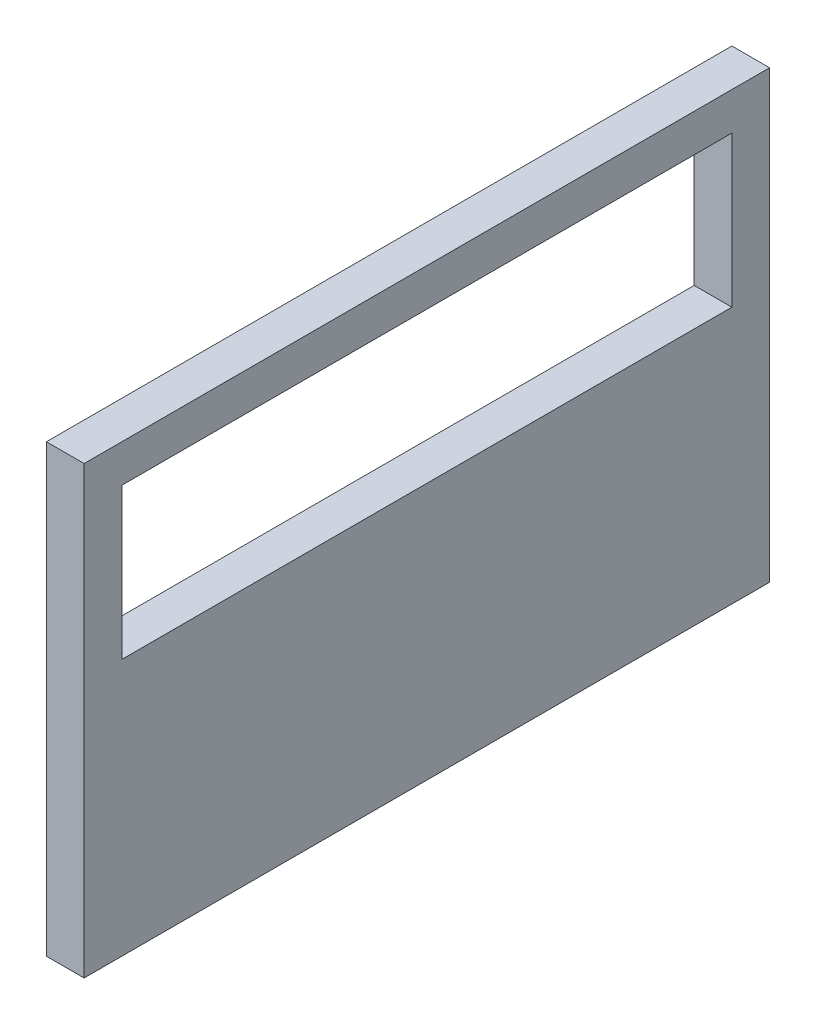
ISO-10303-21;
HEADER;
FILE_DESCRIPTION(('STEP AP214'),'2;1');
FILE_NAME('part.step','',(''),(''),'','','');
FILE_SCHEMA(('AUTOMOTIVE_DESIGN { 1 0 10303 214 1 1 1 1 }'));
ENDSEC;
DATA;
#1=APPLICATION_CONTEXT('core data for automotive mechanical design processes');
#2=APPLICATION_PROTOCOL_DEFINITION('international standard','automotive_design',2000,#1);
#3=PRODUCT_CONTEXT('',#1,'mechanical');
#4=PRODUCT('Part','Part','',(#3));
#5=PRODUCT_RELATED_PRODUCT_CATEGORY('part','',(#4));
#6=PRODUCT_DEFINITION_FORMATION('','',#4);
#7=PRODUCT_DEFINITION_CONTEXT('part definition',#1,'design');
#8=PRODUCT_DEFINITION('design','',#6,#7);
#9=PRODUCT_DEFINITION_SHAPE('','',#8);
#10=(LENGTH_UNIT() NAMED_UNIT(*) SI_UNIT(.MILLI.,.METRE.));
#11=(NAMED_UNIT(*) PLANE_ANGLE_UNIT() SI_UNIT($,.RADIAN.));
#12=(NAMED_UNIT(*) SI_UNIT($,.STERADIAN.) SOLID_ANGLE_UNIT());
#13=UNCERTAINTY_MEASURE_WITH_UNIT(LENGTH_MEASURE(1.E-05),#10,'distance_accuracy_value','');
#14=(GEOMETRIC_REPRESENTATION_CONTEXT(3) GLOBAL_UNCERTAINTY_ASSIGNED_CONTEXT((#13)) GLOBAL_UNIT_ASSIGNED_CONTEXT((#10,
#11,#12)) REPRESENTATION_CONTEXT('',''));
#15=CARTESIAN_POINT('',(0.,0.,0.));
#16=DIRECTION('',(0.,0.,1.));
#17=DIRECTION('',(1.,0.,0.));
#18=AXIS2_PLACEMENT_3D('',#15,#16,#17);
#19=CARTESIAN_POINT('',(0.00999999999999891,0.,400.01));
#20=DIRECTION('',(0.,-1.,0.));
#21=DIRECTION('',(-1.,0.,0.));
#22=AXIS2_PLACEMENT_3D('',#19,#20,#21);
#23=PLANE('',#22);
#24=DIRECTION('',(0.,0.,1.));
#25=VECTOR('',#24,1.);
#26=CARTESIAN_POINT('',(-22.,0.,200.));
#27=LINE('',#26,#25);
#28=CARTESIAN_POINT('',(-22.,0.,0.));
#29=VERTEX_POINT('',#28);
#30=CARTESIAN_POINT('',(-22.,0.,400.));
#31=VERTEX_POINT('',#30);
#32=EDGE_CURVE('E80',#29,#31,#27,.T.);
#33=ORIENTED_EDGE('',*,*,#32,.F.);
#34=DIRECTION('',(-1.,0.,0.));
#35=VECTOR('',#34,1.);
#36=CARTESIAN_POINT('',(-11.,0.,0.));
#37=LINE('',#36,#35);
#38=CARTESIAN_POINT('',(0.,0.,0.));
#39=VERTEX_POINT('',#38);
#40=EDGE_CURVE('E21',#39,#29,#37,.T.);
#41=ORIENTED_EDGE('',*,*,#40,.F.);
#42=DIRECTION('',(0.,0.,-1.));
#43=VECTOR('',#42,1.);
#44=CARTESIAN_POINT('',(0.,0.,200.));
#45=LINE('',#44,#43);
#46=CARTESIAN_POINT('',(0.,0.,400.));
#47=VERTEX_POINT('',#46);
#48=EDGE_CURVE('E86',#47,#39,#45,.T.);
#49=ORIENTED_EDGE('',*,*,#48,.F.);
#50=DIRECTION('',(1.,0.,0.));
#51=VECTOR('',#50,1.);
#52=CARTESIAN_POINT('',(-11.,0.,400.));
#53=LINE('',#52,#51);
#54=EDGE_CURVE('E83',#31,#47,#53,.T.);
#55=ORIENTED_EDGE('',*,*,#54,.F.);
#56=EDGE_LOOP('',(#33,#41,#49,#55));
#57=FACE_BOUND('',#56,.T.);
#58=ADVANCED_FACE('F17',(#57),#23,.T.);
#59=CARTESIAN_POINT('',(0.01,-0.01,0.));
#60=DIRECTION('',(0.,0.,-1.));
#61=DIRECTION('',(-1.,0.,0.));
#62=AXIS2_PLACEMENT_3D('',#59,#60,#61);
#63=PLANE('',#62);
#64=DIRECTION('',(-1.,0.,0.));
#65=VECTOR('',#64,1.);
#66=CARTESIAN_POINT('',(-11.,260.,0.));
#67=LINE('',#66,#65);
#68=CARTESIAN_POINT('',(0.,260.,0.));
#69=VERTEX_POINT('',#68);
#70=CARTESIAN_POINT('',(-22.,260.,0.));
#71=VERTEX_POINT('',#70);
#72=EDGE_CURVE('E91',#69,#71,#67,.T.);
#73=ORIENTED_EDGE('',*,*,#72,.F.);
#74=DIRECTION('',(0.,1.,0.));
#75=VECTOR('',#74,1.);
#76=CARTESIAN_POINT('',(0.,130.,0.));
#77=LINE('',#76,#75);
#78=EDGE_CURVE('E114',#39,#69,#77,.T.);
#79=ORIENTED_EDGE('',*,*,#78,.F.);
#80=ORIENTED_EDGE('',*,*,#40,.T.);
#81=DIRECTION('',(0.,-1.,0.));
#82=VECTOR('',#81,1.);
#83=CARTESIAN_POINT('',(-22.,130.,0.));
#84=LINE('',#83,#82);
#85=EDGE_CURVE('E104',#71,#29,#84,.T.);
#86=ORIENTED_EDGE('',*,*,#85,.F.);
#87=EDGE_LOOP('',(#73,#79,#80,#86));
#88=FACE_BOUND('',#87,.T.);
#89=ADVANCED_FACE('F112',(#88),#63,.T.);
#90=CARTESIAN_POINT('',(-22.01,260.,-0.0100000000000122));
#91=DIRECTION('',(0.,1.,0.));
#92=DIRECTION('',(0.,0.,1.));
#93=AXIS2_PLACEMENT_3D('',#90,#91,#92);
#94=PLANE('',#93);
#95=DIRECTION('',(0.,0.,-1.));
#96=VECTOR('',#95,1.);
#97=CARTESIAN_POINT('',(-22.,260.,200.));
#98=LINE('',#97,#96);
#99=CARTESIAN_POINT('',(-22.,260.,400.));
#100=VERTEX_POINT('',#99);
#101=EDGE_CURVE('E99',#100,#71,#98,.T.);
#102=ORIENTED_EDGE('',*,*,#101,.F.);
#103=DIRECTION('',(-1.,0.,0.));
#104=VECTOR('',#103,1.);
#105=CARTESIAN_POINT('',(-11.,260.,400.));
#106=LINE('',#105,#104);
#107=CARTESIAN_POINT('',(0.,260.,400.));
#108=VERTEX_POINT('',#107);
#109=EDGE_CURVE('E90',#108,#100,#106,.T.);
#110=ORIENTED_EDGE('',*,*,#109,.F.);
#111=DIRECTION('',(0.,0.,1.));
#112=VECTOR('',#111,1.);
#113=CARTESIAN_POINT('',(0.,260.,200.));
#114=LINE('',#113,#112);
#115=EDGE_CURVE('E117',#69,#108,#114,.T.);
#116=ORIENTED_EDGE('',*,*,#115,.F.);
#117=ORIENTED_EDGE('',*,*,#72,.T.);
#118=EDGE_LOOP('',(#102,#110,#116,#117));
#119=FACE_BOUND('',#118,.T.);
#120=ADVANCED_FACE('F131',(#119),#94,.T.);
#121=CARTESIAN_POINT('',(-22.01,-0.01,400.));
#122=DIRECTION('',(0.,0.,1.));
#123=DIRECTION('',(1.,0.,0.));
#124=AXIS2_PLACEMENT_3D('',#121,#122,#123);
#125=PLANE('',#124);
#126=ORIENTED_EDGE('',*,*,#109,.T.);
#127=DIRECTION('',(0.,1.,0.));
#128=VECTOR('',#127,1.);
#129=CARTESIAN_POINT('',(-22.,130.,400.));
#130=LINE('',#129,#128);
#131=EDGE_CURVE('E94',#31,#100,#130,.T.);
#132=ORIENTED_EDGE('',*,*,#131,.F.);
#133=ORIENTED_EDGE('',*,*,#54,.T.);
#134=DIRECTION('',(0.,-1.,0.));
#135=VECTOR('',#134,1.);
#136=CARTESIAN_POINT('',(0.,130.,400.));
#137=LINE('',#136,#135);
#138=EDGE_CURVE('E120',#108,#47,#137,.T.);
#139=ORIENTED_EDGE('',*,*,#138,.F.);
#140=EDGE_LOOP('',(#126,#132,#133,#139));
#141=FACE_BOUND('',#140,.T.);
#142=ADVANCED_FACE('F95',(#141),#125,.T.);
#143=CARTESIAN_POINT('',(-22.01,238.01,22.));
#144=DIRECTION('',(0.,0.,1.));
#145=DIRECTION('',(0.,-1.,0.));
#146=AXIS2_PLACEMENT_3D('',#143,#144,#145);
#147=PLANE('',#146);
#148=DIRECTION('',(0.,-1.,0.));
#149=VECTOR('',#148,1.);
#150=CARTESIAN_POINT('',(0.,130.,22.));
#151=LINE('',#150,#149);
#152=CARTESIAN_POINT('',(0.,238.,22.));
#153=VERTEX_POINT('',#152);
#154=CARTESIAN_POINT('',(0.,150.,22.));
#155=VERTEX_POINT('',#154);
#156=EDGE_CURVE('E137',#153,#155,#151,.T.);
#157=ORIENTED_EDGE('',*,*,#156,.F.);
#158=DIRECTION('',(1.,0.,0.));
#159=VECTOR('',#158,1.);
#160=CARTESIAN_POINT('',(-11.,238.,22.));
#161=LINE('',#160,#159);
#162=CARTESIAN_POINT('',(-22.,238.,22.));
#163=VERTEX_POINT('',#162);
#164=EDGE_CURVE('E121',#163,#153,#161,.T.);
#165=ORIENTED_EDGE('',*,*,#164,.F.);
#166=DIRECTION('',(0.,1.,0.));
#167=VECTOR('',#166,1.);
#168=CARTESIAN_POINT('',(-22.,130.,22.));
#169=LINE('',#168,#167);
#170=CARTESIAN_POINT('',(-22.,150.,22.));
#171=VERTEX_POINT('',#170);
#172=EDGE_CURVE('E129',#171,#163,#169,.T.);
#173=ORIENTED_EDGE('',*,*,#172,.F.);
#174=DIRECTION('',(-1.,0.,0.));
#175=VECTOR('',#174,1.);
#176=CARTESIAN_POINT('',(-11.,150.,22.));
#177=LINE('',#176,#175);
#178=EDGE_CURVE('E143',#155,#171,#177,.T.);
#179=ORIENTED_EDGE('',*,*,#178,.F.);
#180=EDGE_LOOP('',(#157,#165,#173,#179));
#181=FACE_BOUND('',#180,.T.);
#182=ADVANCED_FACE('F161',(#181),#147,.T.);
#183=CARTESIAN_POINT('',(-22.,-0.01,-0.01));
#184=DIRECTION('',(-1.,0.,0.));
#185=DIRECTION('',(0.,0.,1.));
#186=AXIS2_PLACEMENT_3D('',#183,#184,#185);
#187=PLANE('',#186);
#188=ORIENTED_EDGE('',*,*,#172,.T.);
#189=DIRECTION('',(0.,0.,-1.));
#190=VECTOR('',#189,1.);
#191=CARTESIAN_POINT('',(-22.,238.,200.));
#192=LINE('',#191,#190);
#193=CARTESIAN_POINT('',(-22.,238.,378.));
#194=VERTEX_POINT('',#193);
#195=EDGE_CURVE('E123',#194,#163,#192,.T.);
#196=ORIENTED_EDGE('',*,*,#195,.F.);
#197=DIRECTION('',(0.,1.,0.));
#198=VECTOR('',#197,1.);
#199=CARTESIAN_POINT('',(-22.,194.,378.));
#200=LINE('',#199,#198);
#201=CARTESIAN_POINT('',(-22.,150.,378.));
#202=VERTEX_POINT('',#201);
#203=EDGE_CURVE('E146',#202,#194,#200,.T.);
#204=ORIENTED_EDGE('',*,*,#203,.F.);
#205=DIRECTION('',(0.,0.,1.));
#206=VECTOR('',#205,1.);
#207=CARTESIAN_POINT('',(-22.,150.,200.));
#208=LINE('',#207,#206);
#209=EDGE_CURVE('E139',#171,#202,#208,.T.);
#210=ORIENTED_EDGE('',*,*,#209,.F.);
#211=EDGE_LOOP('',(#188,#196,#204,#210));
#212=FACE_BOUND('',#211,.T.);
#213=ORIENTED_EDGE('',*,*,#101,.T.);
#214=ORIENTED_EDGE('',*,*,#85,.T.);
#215=ORIENTED_EDGE('',*,*,#32,.T.);
#216=ORIENTED_EDGE('',*,*,#131,.T.);
#217=EDGE_LOOP('',(#213,#214,#215,#216));
#218=FACE_BOUND('',#217,.T.);
#219=ADVANCED_FACE('F102',(#212,#218),#187,.T.);
#220=CARTESIAN_POINT('',(-22.01,238.,378.01));
#221=DIRECTION('',(0.,-1.,0.));
#222=DIRECTION('',(0.,0.,-1.));
#223=AXIS2_PLACEMENT_3D('',#220,#221,#222);
#224=PLANE('',#223);
#225=DIRECTION('',(0.,0.,-1.));
#226=VECTOR('',#225,1.);
#227=CARTESIAN_POINT('',(0.,238.,200.));
#228=LINE('',#227,#226);
#229=CARTESIAN_POINT('',(0.,238.,378.));
#230=VERTEX_POINT('',#229);
#231=EDGE_CURVE('E132',#230,#153,#228,.T.);
#232=ORIENTED_EDGE('',*,*,#231,.F.);
#233=DIRECTION('',(1.,0.,0.));
#234=VECTOR('',#233,1.);
#235=CARTESIAN_POINT('',(-11.,238.,378.));
#236=LINE('',#235,#234);
#237=EDGE_CURVE('E149',#194,#230,#236,.T.);
#238=ORIENTED_EDGE('',*,*,#237,.F.);
#239=ORIENTED_EDGE('',*,*,#195,.T.);
#240=ORIENTED_EDGE('',*,*,#164,.T.);
#241=EDGE_LOOP('',(#232,#238,#239,#240));
#242=FACE_BOUND('',#241,.T.);
#243=ADVANCED_FACE('F158',(#242),#224,.T.);
#244=CARTESIAN_POINT('',(0.,-0.01,400.01));
#245=DIRECTION('',(1.,0.,0.));
#246=DIRECTION('',(0.,0.,-1.));
#247=AXIS2_PLACEMENT_3D('',#244,#245,#246);
#248=PLANE('',#247);
#249=ORIENTED_EDGE('',*,*,#156,.T.);
#250=DIRECTION('',(0.,0.,-1.));
#251=VECTOR('',#250,1.);
#252=CARTESIAN_POINT('',(0.,150.,200.));
#253=LINE('',#252,#251);
#254=CARTESIAN_POINT('',(0.,150.,378.));
#255=VERTEX_POINT('',#254);
#256=EDGE_CURVE('E36',#255,#155,#253,.T.);
#257=ORIENTED_EDGE('',*,*,#256,.F.);
#258=DIRECTION('',(0.,-1.,0.));
#259=VECTOR('',#258,1.);
#260=CARTESIAN_POINT('',(0.,194.,378.));
#261=LINE('',#260,#259);
#262=EDGE_CURVE('E27',#230,#255,#261,.T.);
#263=ORIENTED_EDGE('',*,*,#262,.F.);
#264=ORIENTED_EDGE('',*,*,#231,.T.);
#265=EDGE_LOOP('',(#249,#257,#263,#264));
#266=FACE_BOUND('',#265,.T.);
#267=ORIENTED_EDGE('',*,*,#115,.T.);
#268=ORIENTED_EDGE('',*,*,#138,.T.);
#269=ORIENTED_EDGE('',*,*,#48,.T.);
#270=ORIENTED_EDGE('',*,*,#78,.T.);
#271=EDGE_LOOP('',(#267,#268,#269,#270));
#272=FACE_BOUND('',#271,.T.);
#273=ADVANCED_FACE('F119',(#266,#272),#248,.T.);
#274=CARTESIAN_POINT('',(-22.01,150.,21.9900000000001));
#275=DIRECTION('',(0.,1.,0.));
#276=DIRECTION('',(0.,0.,1.));
#277=AXIS2_PLACEMENT_3D('',#274,#275,#276);
#278=PLANE('',#277);
#279=ORIENTED_EDGE('',*,*,#256,.T.);
#280=ORIENTED_EDGE('',*,*,#178,.T.);
#281=ORIENTED_EDGE('',*,*,#209,.T.);
#282=DIRECTION('',(-1.,0.,0.));
#283=VECTOR('',#282,1.);
#284=CARTESIAN_POINT('',(-11.,150.,378.));
#285=LINE('',#284,#283);
#286=EDGE_CURVE('E11',#255,#202,#285,.T.);
#287=ORIENTED_EDGE('',*,*,#286,.F.);
#288=EDGE_LOOP('',(#279,#280,#281,#287));
#289=FACE_BOUND('',#288,.T.);
#290=ADVANCED_FACE('F164',(#289),#278,.T.);
#291=CARTESIAN_POINT('',(-22.01,149.99,378.));
#292=DIRECTION('',(0.,0.,-1.));
#293=DIRECTION('',(0.,1.,0.));
#294=AXIS2_PLACEMENT_3D('',#291,#292,#293);
#295=PLANE('',#294);
#296=ORIENTED_EDGE('',*,*,#262,.T.);
#297=ORIENTED_EDGE('',*,*,#286,.T.);
#298=ORIENTED_EDGE('',*,*,#203,.T.);
#299=ORIENTED_EDGE('',*,*,#237,.T.);
#300=EDGE_LOOP('',(#296,#297,#298,#299));
#301=FACE_BOUND('',#300,.T.);
#302=ADVANCED_FACE('F19',(#301),#295,.T.);
#303=CLOSED_SHELL('',(#58,#89,#120,#142,#182,#219,#243,#273,#290,#302));
#304=MANIFOLD_SOLID_BREP('B1',#303);
#305=ADVANCED_BREP_SHAPE_REPRESENTATION('',(#18,#304),#14);
#306=SHAPE_DEFINITION_REPRESENTATION(#9,#305);
ENDSEC;
END-ISO-10303-21;
